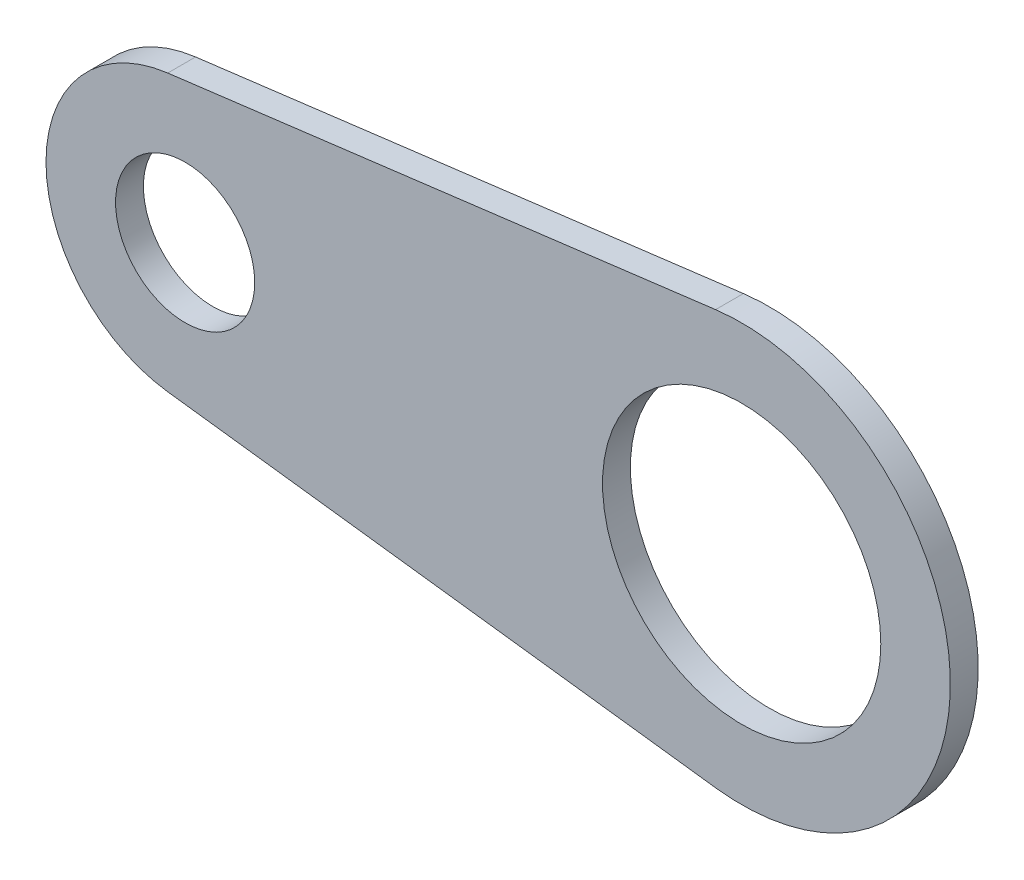
ISO-10303-21;
HEADER;
FILE_DESCRIPTION(('STEP AP214'),'2;1');
FILE_NAME('part.step','',(''),(''),'','','');
FILE_SCHEMA(('AUTOMOTIVE_DESIGN { 1 0 10303 214 1 1 1 1 }'));
ENDSEC;
DATA;
#1=APPLICATION_CONTEXT('core data for automotive mechanical design processes');
#2=APPLICATION_PROTOCOL_DEFINITION('international standard','automotive_design',2000,#1);
#3=PRODUCT_CONTEXT('',#1,'mechanical');
#4=PRODUCT('Part','Part','',(#3));
#5=PRODUCT_RELATED_PRODUCT_CATEGORY('part','',(#4));
#6=PRODUCT_DEFINITION_FORMATION('','',#4);
#7=PRODUCT_DEFINITION_CONTEXT('part definition',#1,'design');
#8=PRODUCT_DEFINITION('design','',#6,#7);
#9=PRODUCT_DEFINITION_SHAPE('','',#8);
#10=(LENGTH_UNIT() NAMED_UNIT(*) SI_UNIT(.MILLI.,.METRE.));
#11=(NAMED_UNIT(*) PLANE_ANGLE_UNIT() SI_UNIT($,.RADIAN.));
#12=(NAMED_UNIT(*) SI_UNIT($,.STERADIAN.) SOLID_ANGLE_UNIT());
#13=UNCERTAINTY_MEASURE_WITH_UNIT(LENGTH_MEASURE(1.E-05),#10,'distance_accuracy_value','');
#14=(GEOMETRIC_REPRESENTATION_CONTEXT(3) GLOBAL_UNCERTAINTY_ASSIGNED_CONTEXT((#13)) GLOBAL_UNIT_ASSIGNED_CONTEXT((#10,
#11,#12)) REPRESENTATION_CONTEXT('',''));
#15=CARTESIAN_POINT('',(0.,0.,0.));
#16=DIRECTION('',(0.,0.,1.));
#17=DIRECTION('',(1.,0.,0.));
#18=AXIS2_PLACEMENT_3D('',#15,#16,#17);
#19=CARTESIAN_POINT('',(0.,0.,1.));
#20=DIRECTION('',(0.,0.,1.));
#21=DIRECTION('',(1.,0.,0.));
#22=AXIS2_PLACEMENT_3D('',#19,#20,#21);
#23=PLANE('',#22);
#24=CARTESIAN_POINT('',(0.,0.,1.));
#25=DIRECTION('',(0.,0.,1.));
#26=DIRECTION('',(1.,0.,0.));
#27=AXIS2_PLACEMENT_3D('',#24,#25,#26);
#28=CIRCLE('',#27,5.);
#29=CARTESIAN_POINT('',(5.,0.,1.));
#30=VERTEX_POINT('',#29);
#31=EDGE_CURVE('E102',#30,#30,#28,.T.);
#32=ORIENTED_EDGE('',*,*,#31,.F.);
#33=EDGE_LOOP('',(#32));
#34=FACE_BOUND('',#33,.T.);
#35=CARTESIAN_POINT('',(0.,0.,1.));
#36=DIRECTION('',(0.,0.,1.));
#37=DIRECTION('',(1.,0.,0.));
#38=AXIS2_PLACEMENT_3D('',#35,#36,#37);
#39=CIRCLE('',#38,7.5);
#40=CARTESIAN_POINT('',(-0.9375,-7.44117556236916,1.));
#41=VERTEX_POINT('',#40);
#42=CARTESIAN_POINT('',(-0.937499999999999,7.44117556236916,1.));
#43=VERTEX_POINT('',#42);
#44=EDGE_CURVE('E87',#41,#43,#39,.T.);
#45=ORIENTED_EDGE('',*,*,#44,.T.);
#46=DIRECTION('',(-0.992156741649221,-0.125,0.));
#47=VECTOR('',#46,1.);
#48=CARTESIAN_POINT('',(-0.937499999999999,7.44117556236916,1.));
#49=LINE('',#48,#47);
#50=CARTESIAN_POINT('',(-20.625,4.96078370824611,1.));
#51=VERTEX_POINT('',#50);
#52=EDGE_CURVE('E82',#43,#51,#49,.T.);
#53=ORIENTED_EDGE('',*,*,#52,.T.);
#54=CARTESIAN_POINT('',(-20.,0.,1.));
#55=DIRECTION('',(0.,0.,1.));
#56=DIRECTION('',(1.,0.,0.));
#57=AXIS2_PLACEMENT_3D('',#54,#55,#56);
#58=CIRCLE('',#57,5.);
#59=CARTESIAN_POINT('',(-20.625,-4.96078370824611,1.));
#60=VERTEX_POINT('',#59);
#61=EDGE_CURVE('E85',#51,#60,#58,.T.);
#62=ORIENTED_EDGE('',*,*,#61,.T.);
#63=DIRECTION('',(0.992156741649221,-0.125,0.));
#64=VECTOR('',#63,1.);
#65=CARTESIAN_POINT('',(-0.9375,-7.44117556236916,1.));
#66=LINE('',#65,#64);
#67=EDGE_CURVE('E52',#60,#41,#66,.T.);
#68=ORIENTED_EDGE('',*,*,#67,.T.);
#69=EDGE_LOOP('',(#45,#53,#62,#68));
#70=FACE_BOUND('',#69,.T.);
#71=CARTESIAN_POINT('',(-20.,0.,1.));
#72=DIRECTION('',(0.,0.,1.));
#73=DIRECTION('',(1.,0.,0.));
#74=AXIS2_PLACEMENT_3D('',#71,#72,#73);
#75=CIRCLE('',#74,2.5);
#76=CARTESIAN_POINT('',(-17.5,0.,1.));
#77=VERTEX_POINT('',#76);
#78=EDGE_CURVE('E117',#77,#77,#75,.T.);
#79=ORIENTED_EDGE('',*,*,#78,.F.);
#80=EDGE_LOOP('',(#79));
#81=FACE_BOUND('',#80,.T.);
#82=ADVANCED_FACE('F35',(#34,#70,#81),#23,.T.);
#83=CARTESIAN_POINT('',(0.,0.,0.));
#84=DIRECTION('',(0.,0.,1.));
#85=DIRECTION('',(1.,0.,0.));
#86=AXIS2_PLACEMENT_3D('',#83,#84,#85);
#87=PLANE('',#86);
#88=CARTESIAN_POINT('',(0.,0.,0.));
#89=DIRECTION('',(0.,0.,1.));
#90=DIRECTION('',(1.,0.,0.));
#91=AXIS2_PLACEMENT_3D('',#88,#89,#90);
#92=CIRCLE('',#91,7.5);
#93=CARTESIAN_POINT('',(-0.9375,-7.44117556236916,0.));
#94=VERTEX_POINT('',#93);
#95=CARTESIAN_POINT('',(-0.937499999999999,7.44117556236916,0.));
#96=VERTEX_POINT('',#95);
#97=EDGE_CURVE('E99',#94,#96,#92,.T.);
#98=ORIENTED_EDGE('',*,*,#97,.F.);
#99=DIRECTION('',(0.992156741649221,-0.125,0.));
#100=VECTOR('',#99,1.);
#101=CARTESIAN_POINT('',(-0.9375,-7.44117556236916,0.));
#102=LINE('',#101,#100);
#103=CARTESIAN_POINT('',(-20.625,-4.96078370824611,0.));
#104=VERTEX_POINT('',#103);
#105=EDGE_CURVE('E75',#104,#94,#102,.T.);
#106=ORIENTED_EDGE('',*,*,#105,.F.);
#107=CARTESIAN_POINT('',(-20.,0.,0.));
#108=DIRECTION('',(0.,0.,1.));
#109=DIRECTION('',(1.,0.,0.));
#110=AXIS2_PLACEMENT_3D('',#107,#108,#109);
#111=CIRCLE('',#110,5.);
#112=CARTESIAN_POINT('',(-20.625,4.96078370824611,0.));
#113=VERTEX_POINT('',#112);
#114=EDGE_CURVE('E69',#113,#104,#111,.T.);
#115=ORIENTED_EDGE('',*,*,#114,.F.);
#116=DIRECTION('',(-0.992156741649221,-0.125,0.));
#117=VECTOR('',#116,1.);
#118=CARTESIAN_POINT('',(-0.937499999999999,7.44117556236916,0.));
#119=LINE('',#118,#117);
#120=EDGE_CURVE('E91',#96,#113,#119,.T.);
#121=ORIENTED_EDGE('',*,*,#120,.F.);
#122=EDGE_LOOP('',(#98,#106,#115,#121));
#123=FACE_BOUND('',#122,.T.);
#124=CARTESIAN_POINT('',(0.,0.,0.));
#125=DIRECTION('',(0.,0.,1.));
#126=DIRECTION('',(1.,0.,0.));
#127=AXIS2_PLACEMENT_3D('',#124,#125,#126);
#128=CIRCLE('',#127,5.);
#129=CARTESIAN_POINT('',(5.,0.,0.));
#130=VERTEX_POINT('',#129);
#131=EDGE_CURVE('E114',#130,#130,#128,.T.);
#132=ORIENTED_EDGE('',*,*,#131,.T.);
#133=EDGE_LOOP('',(#132));
#134=FACE_BOUND('',#133,.T.);
#135=CARTESIAN_POINT('',(-20.,0.,0.));
#136=DIRECTION('',(0.,0.,1.));
#137=DIRECTION('',(1.,0.,0.));
#138=AXIS2_PLACEMENT_3D('',#135,#136,#137);
#139=CIRCLE('',#138,2.5);
#140=CARTESIAN_POINT('',(-17.5,0.,0.));
#141=VERTEX_POINT('',#140);
#142=EDGE_CURVE('E120',#141,#141,#139,.T.);
#143=ORIENTED_EDGE('',*,*,#142,.T.);
#144=EDGE_LOOP('',(#143));
#145=FACE_BOUND('',#144,.T.);
#146=ADVANCED_FACE('F110',(#123,#134,#145),#87,.F.);
#147=CARTESIAN_POINT('',(0.,0.,1.));
#148=DIRECTION('',(0.,0.,-1.));
#149=DIRECTION('',(-1.,0.,0.));
#150=AXIS2_PLACEMENT_3D('',#147,#148,#149);
#151=CYLINDRICAL_SURFACE('',#150,7.5);
#152=ORIENTED_EDGE('',*,*,#97,.T.);
#153=DIRECTION('',(0.,0.,-1.));
#154=VECTOR('',#153,1.);
#155=CARTESIAN_POINT('',(-0.937499999999999,7.44117556236916,1.));
#156=LINE('',#155,#154);
#157=EDGE_CURVE('E11',#43,#96,#156,.T.);
#158=ORIENTED_EDGE('',*,*,#157,.F.);
#159=ORIENTED_EDGE('',*,*,#44,.F.);
#160=DIRECTION('',(0.,0.,-1.));
#161=VECTOR('',#160,1.);
#162=CARTESIAN_POINT('',(-0.9375,-7.44117556236916,1.));
#163=LINE('',#162,#161);
#164=EDGE_CURVE('E95',#41,#94,#163,.T.);
#165=ORIENTED_EDGE('',*,*,#164,.T.);
#166=EDGE_LOOP('',(#152,#158,#159,#165));
#167=FACE_BOUND('',#166,.T.);
#168=ADVANCED_FACE('F37',(#167),#151,.T.);
#169=CARTESIAN_POINT('',(-0.937499999999999,7.44117556236916,1.));
#170=DIRECTION('',(0.125,-0.992156741649222,0.));
#171=DIRECTION('',(0.992156741649222,0.125,0.));
#172=AXIS2_PLACEMENT_3D('',#169,#170,#171);
#173=PLANE('',#172);
#174=ORIENTED_EDGE('',*,*,#120,.T.);
#175=DIRECTION('',(0.,0.,-1.));
#176=VECTOR('',#175,1.);
#177=CARTESIAN_POINT('',(-20.625,4.96078370824611,1.));
#178=LINE('',#177,#176);
#179=EDGE_CURVE('E44',#51,#113,#178,.T.);
#180=ORIENTED_EDGE('',*,*,#179,.F.);
#181=ORIENTED_EDGE('',*,*,#52,.F.);
#182=ORIENTED_EDGE('',*,*,#157,.T.);
#183=EDGE_LOOP('',(#174,#180,#181,#182));
#184=FACE_BOUND('',#183,.T.);
#185=ADVANCED_FACE('F90',(#184),#173,.F.);
#186=CARTESIAN_POINT('',(-20.,0.,1.));
#187=DIRECTION('',(0.,0.,-1.));
#188=DIRECTION('',(-1.,0.,0.));
#189=AXIS2_PLACEMENT_3D('',#186,#187,#188);
#190=CYLINDRICAL_SURFACE('',#189,5.);
#191=ORIENTED_EDGE('',*,*,#114,.T.);
#192=DIRECTION('',(0.,0.,-1.));
#193=VECTOR('',#192,1.);
#194=CARTESIAN_POINT('',(-20.625,-4.96078370824611,1.));
#195=LINE('',#194,#193);
#196=EDGE_CURVE('E92',#60,#104,#195,.T.);
#197=ORIENTED_EDGE('',*,*,#196,.F.);
#198=ORIENTED_EDGE('',*,*,#61,.F.);
#199=ORIENTED_EDGE('',*,*,#179,.T.);
#200=EDGE_LOOP('',(#191,#197,#198,#199));
#201=FACE_BOUND('',#200,.T.);
#202=ADVANCED_FACE('F93',(#201),#190,.T.);
#203=CARTESIAN_POINT('',(-0.9375,-7.44117556236916,1.));
#204=DIRECTION('',(0.125,0.992156741649222,0.));
#205=DIRECTION('',(-0.992156741649222,0.125,0.));
#206=AXIS2_PLACEMENT_3D('',#203,#204,#205);
#207=PLANE('',#206);
#208=ORIENTED_EDGE('',*,*,#105,.T.);
#209=ORIENTED_EDGE('',*,*,#164,.F.);
#210=ORIENTED_EDGE('',*,*,#67,.F.);
#211=ORIENTED_EDGE('',*,*,#196,.T.);
#212=EDGE_LOOP('',(#208,#209,#210,#211));
#213=FACE_BOUND('',#212,.T.);
#214=ADVANCED_FACE('F107',(#213),#207,.F.);
#215=CARTESIAN_POINT('',(0.,0.,1.));
#216=DIRECTION('',(0.,0.,-1.));
#217=DIRECTION('',(-1.,0.,0.));
#218=AXIS2_PLACEMENT_3D('',#215,#216,#217);
#219=CYLINDRICAL_SURFACE('',#218,5.);
#220=ORIENTED_EDGE('',*,*,#31,.T.);
#221=EDGE_LOOP('',(#220));
#222=FACE_BOUND('',#221,.T.);
#223=ORIENTED_EDGE('',*,*,#131,.F.);
#224=EDGE_LOOP('',(#223));
#225=FACE_BOUND('',#224,.T.);
#226=ADVANCED_FACE('F137',(#222,#225),#219,.F.);
#227=CARTESIAN_POINT('',(-20.,0.,1.));
#228=DIRECTION('',(0.,0.,-1.));
#229=DIRECTION('',(-1.,0.,0.));
#230=AXIS2_PLACEMENT_3D('',#227,#228,#229);
#231=CYLINDRICAL_SURFACE('',#230,2.5);
#232=ORIENTED_EDGE('',*,*,#78,.T.);
#233=EDGE_LOOP('',(#232));
#234=FACE_BOUND('',#233,.T.);
#235=ORIENTED_EDGE('',*,*,#142,.F.);
#236=EDGE_LOOP('',(#235));
#237=FACE_BOUND('',#236,.T.);
#238=ADVANCED_FACE('F126',(#234,#237),#231,.F.);
#239=CLOSED_SHELL('',(#82,#146,#168,#185,#202,#214,#226,#238));
#240=MANIFOLD_SOLID_BREP('B2',#239);
#241=ADVANCED_BREP_SHAPE_REPRESENTATION('',(#18,#240),#14);
#242=SHAPE_DEFINITION_REPRESENTATION(#9,#241);
ENDSEC;
END-ISO-10303-21;
